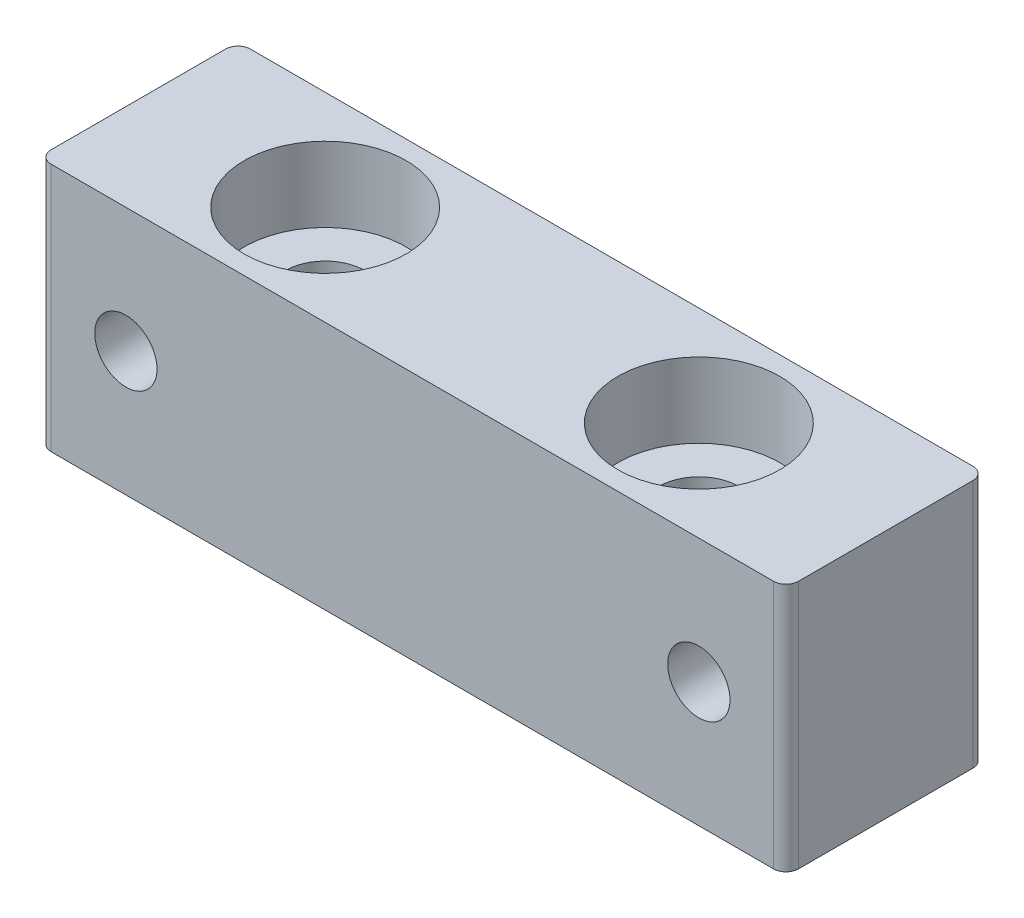
ISO-10303-21;
HEADER;
FILE_DESCRIPTION(('STEP AP214'),'2;1');
FILE_NAME('part.step','',(''),(''),'','','');
FILE_SCHEMA(('AUTOMOTIVE_DESIGN { 1 0 10303 214 1 1 1 1 }'));
ENDSEC;
DATA;
#1=APPLICATION_CONTEXT('core data for automotive mechanical design processes');
#2=APPLICATION_PROTOCOL_DEFINITION('international standard','automotive_design',2000,#1);
#3=PRODUCT_CONTEXT('',#1,'mechanical');
#4=PRODUCT('Part','Part','',(#3));
#5=PRODUCT_RELATED_PRODUCT_CATEGORY('part','',(#4));
#6=PRODUCT_DEFINITION_FORMATION('','',#4);
#7=PRODUCT_DEFINITION_CONTEXT('part definition',#1,'design');
#8=PRODUCT_DEFINITION('design','',#6,#7);
#9=PRODUCT_DEFINITION_SHAPE('','',#8);
#10=(LENGTH_UNIT() NAMED_UNIT(*) SI_UNIT(.MILLI.,.METRE.));
#11=(NAMED_UNIT(*) PLANE_ANGLE_UNIT() SI_UNIT($,.RADIAN.));
#12=(NAMED_UNIT(*) SI_UNIT($,.STERADIAN.) SOLID_ANGLE_UNIT());
#13=UNCERTAINTY_MEASURE_WITH_UNIT(LENGTH_MEASURE(1.E-05),#10,'distance_accuracy_value','');
#14=(GEOMETRIC_REPRESENTATION_CONTEXT(3) GLOBAL_UNCERTAINTY_ASSIGNED_CONTEXT((#13)) GLOBAL_UNIT_ASSIGNED_CONTEXT((#10,
#11,#12)) REPRESENTATION_CONTEXT('',''));
#15=CARTESIAN_POINT('',(0.,0.,0.));
#16=DIRECTION('',(0.,0.,1.));
#17=DIRECTION('',(1.,0.,0.));
#18=AXIS2_PLACEMENT_3D('',#15,#16,#17);
#19=CARTESIAN_POINT('',(-15.,10.,4.));
#20=DIRECTION('',(1.,0.,0.));
#21=DIRECTION('',(0.,0.,-1.));
#22=AXIS2_PLACEMENT_3D('',#19,#20,#21);
#23=PLANE('',#22);
#24=DIRECTION('',(0.,0.,1.));
#25=VECTOR('',#24,1.);
#26=CARTESIAN_POINT('',(-15.,0.,4.));
#27=LINE('',#26,#25);
#28=CARTESIAN_POINT('',(-15.,0.,-3.5));
#29=VERTEX_POINT('',#28);
#30=CARTESIAN_POINT('',(-15.,0.,3.5));
#31=VERTEX_POINT('',#30);
#32=EDGE_CURVE('E140',#29,#31,#27,.T.);
#33=ORIENTED_EDGE('',*,*,#32,.T.);
#34=DIRECTION('',(0.,-1.,0.));
#35=VECTOR('',#34,1.);
#36=CARTESIAN_POINT('',(-15.,10.,3.5));
#37=LINE('',#36,#35);
#38=CARTESIAN_POINT('',(-15.,10.,3.5));
#39=VERTEX_POINT('',#38);
#40=EDGE_CURVE('E11',#31,#39,#37,.F.);
#41=ORIENTED_EDGE('',*,*,#40,.T.);
#42=DIRECTION('',(0.,0.,1.));
#43=VECTOR('',#42,1.);
#44=CARTESIAN_POINT('',(-15.,10.,4.));
#45=LINE('',#44,#43);
#46=CARTESIAN_POINT('',(-15.,10.,-3.5));
#47=VERTEX_POINT('',#46);
#48=EDGE_CURVE('E138',#47,#39,#45,.T.);
#49=ORIENTED_EDGE('',*,*,#48,.F.);
#50=DIRECTION('',(0.,-1.,0.));
#51=VECTOR('',#50,1.);
#52=CARTESIAN_POINT('',(-15.,10.,-3.5));
#53=LINE('',#52,#51);
#54=EDGE_CURVE('E47',#47,#29,#53,.T.);
#55=ORIENTED_EDGE('',*,*,#54,.T.);
#56=EDGE_LOOP('',(#33,#41,#49,#55));
#57=FACE_BOUND('',#56,.T.);
#58=ADVANCED_FACE('F38',(#57),#23,.F.);
#59=CARTESIAN_POINT('',(15.,10.,4.));
#60=DIRECTION('',(0.,0.,-1.));
#61=DIRECTION('',(-1.,0.,0.));
#62=AXIS2_PLACEMENT_3D('',#59,#60,#61);
#63=PLANE('',#62);
#64=CARTESIAN_POINT('',(-11.5,5.,4.));
#65=DIRECTION('',(0.,0.,1.));
#66=DIRECTION('',(1.,0.,0.));
#67=AXIS2_PLACEMENT_3D('',#64,#65,#66);
#68=CIRCLE('',#67,1.25);
#69=CARTESIAN_POINT('',(-10.25,5.,4.));
#70=VERTEX_POINT('',#69);
#71=EDGE_CURVE('E242',#70,#70,#68,.T.);
#72=ORIENTED_EDGE('',*,*,#71,.F.);
#73=EDGE_LOOP('',(#72));
#74=FACE_BOUND('',#73,.T.);
#75=CARTESIAN_POINT('',(11.5,5.,4.));
#76=DIRECTION('',(0.,0.,1.));
#77=DIRECTION('',(1.,0.,0.));
#78=AXIS2_PLACEMENT_3D('',#75,#76,#77);
#79=CIRCLE('',#78,1.25);
#80=CARTESIAN_POINT('',(12.75,5.,4.));
#81=VERTEX_POINT('',#80);
#82=EDGE_CURVE('E234',#81,#81,#79,.T.);
#83=ORIENTED_EDGE('',*,*,#82,.F.);
#84=EDGE_LOOP('',(#83));
#85=FACE_BOUND('',#84,.T.);
#86=DIRECTION('',(1.,0.,0.));
#87=VECTOR('',#86,1.);
#88=CARTESIAN_POINT('',(15.,0.,4.));
#89=LINE('',#88,#87);
#90=CARTESIAN_POINT('',(-14.5,0.,4.));
#91=VERTEX_POINT('',#90);
#92=CARTESIAN_POINT('',(14.5,0.,4.));
#93=VERTEX_POINT('',#92);
#94=EDGE_CURVE('E134',#91,#93,#89,.T.);
#95=ORIENTED_EDGE('',*,*,#94,.T.);
#96=DIRECTION('',(0.,-1.,0.));
#97=VECTOR('',#96,1.);
#98=CARTESIAN_POINT('',(14.5,10.,4.));
#99=LINE('',#98,#97);
#100=CARTESIAN_POINT('',(14.5,10.,4.));
#101=VERTEX_POINT('',#100);
#102=EDGE_CURVE('E110',#93,#101,#99,.F.);
#103=ORIENTED_EDGE('',*,*,#102,.T.);
#104=DIRECTION('',(1.,0.,0.));
#105=VECTOR('',#104,1.);
#106=CARTESIAN_POINT('',(15.,10.,4.));
#107=LINE('',#106,#105);
#108=CARTESIAN_POINT('',(-14.5,10.,4.));
#109=VERTEX_POINT('',#108);
#110=EDGE_CURVE('E197',#109,#101,#107,.T.);
#111=ORIENTED_EDGE('',*,*,#110,.F.);
#112=DIRECTION('',(0.,-1.,0.));
#113=VECTOR('',#112,1.);
#114=CARTESIAN_POINT('',(-14.5,10.,4.));
#115=LINE('',#114,#113);
#116=EDGE_CURVE('E116',#109,#91,#115,.T.);
#117=ORIENTED_EDGE('',*,*,#116,.T.);
#118=EDGE_LOOP('',(#95,#103,#111,#117));
#119=FACE_BOUND('',#118,.T.);
#120=ADVANCED_FACE('F249',(#74,#85,#119),#63,.F.);
#121=CARTESIAN_POINT('',(15.,10.,4.));
#122=DIRECTION('',(-1.,0.,0.));
#123=DIRECTION('',(0.,0.,1.));
#124=AXIS2_PLACEMENT_3D('',#121,#122,#123);
#125=PLANE('',#124);
#126=DIRECTION('',(0.,0.,-1.));
#127=VECTOR('',#126,1.);
#128=CARTESIAN_POINT('',(15.,10.,4.));
#129=LINE('',#128,#127);
#130=CARTESIAN_POINT('',(15.,10.,3.5));
#131=VERTEX_POINT('',#130);
#132=CARTESIAN_POINT('',(15.,10.,-3.5));
#133=VERTEX_POINT('',#132);
#134=EDGE_CURVE('E125',#131,#133,#129,.T.);
#135=ORIENTED_EDGE('',*,*,#134,.F.);
#136=DIRECTION('',(0.,-1.,0.));
#137=VECTOR('',#136,1.);
#138=CARTESIAN_POINT('',(15.,10.,3.5));
#139=LINE('',#138,#137);
#140=CARTESIAN_POINT('',(15.,0.,3.5));
#141=VERTEX_POINT('',#140);
#142=EDGE_CURVE('E109',#131,#141,#139,.T.);
#143=ORIENTED_EDGE('',*,*,#142,.T.);
#144=DIRECTION('',(0.,0.,-1.));
#145=VECTOR('',#144,1.);
#146=CARTESIAN_POINT('',(15.,0.,4.));
#147=LINE('',#146,#145);
#148=CARTESIAN_POINT('',(15.,0.,-3.5));
#149=VERTEX_POINT('',#148);
#150=EDGE_CURVE('E123',#141,#149,#147,.T.);
#151=ORIENTED_EDGE('',*,*,#150,.T.);
#152=DIRECTION('',(0.,-1.,0.));
#153=VECTOR('',#152,1.);
#154=CARTESIAN_POINT('',(15.,10.,-3.5));
#155=LINE('',#154,#153);
#156=EDGE_CURVE('E128',#149,#133,#155,.F.);
#157=ORIENTED_EDGE('',*,*,#156,.T.);
#158=EDGE_LOOP('',(#135,#143,#151,#157));
#159=FACE_BOUND('',#158,.T.);
#160=ADVANCED_FACE('F122',(#159),#125,.F.);
#161=CARTESIAN_POINT('',(15.,10.,-4.));
#162=DIRECTION('',(0.,0.,1.));
#163=DIRECTION('',(1.,0.,0.));
#164=AXIS2_PLACEMENT_3D('',#161,#162,#163);
#165=PLANE('',#164);
#166=CARTESIAN_POINT('',(-11.5,5.,-4.));
#167=DIRECTION('',(0.,0.,1.));
#168=DIRECTION('',(1.,0.,0.));
#169=AXIS2_PLACEMENT_3D('',#166,#167,#168);
#170=CIRCLE('',#169,1.25);
#171=CARTESIAN_POINT('',(-10.25,5.,-4.));
#172=VERTEX_POINT('',#171);
#173=EDGE_CURVE('E238',#172,#172,#170,.T.);
#174=ORIENTED_EDGE('',*,*,#173,.T.);
#175=EDGE_LOOP('',(#174));
#176=FACE_BOUND('',#175,.T.);
#177=CARTESIAN_POINT('',(11.5,5.,-4.));
#178=DIRECTION('',(0.,0.,1.));
#179=DIRECTION('',(1.,0.,0.));
#180=AXIS2_PLACEMENT_3D('',#177,#178,#179);
#181=CIRCLE('',#180,1.25);
#182=CARTESIAN_POINT('',(12.75,5.,-4.));
#183=VERTEX_POINT('',#182);
#184=EDGE_CURVE('E230',#183,#183,#181,.T.);
#185=ORIENTED_EDGE('',*,*,#184,.T.);
#186=EDGE_LOOP('',(#185));
#187=FACE_BOUND('',#186,.T.);
#188=DIRECTION('',(-1.,0.,0.));
#189=VECTOR('',#188,1.);
#190=CARTESIAN_POINT('',(15.,10.,-4.));
#191=LINE('',#190,#189);
#192=CARTESIAN_POINT('',(14.5,10.,-4.));
#193=VERTEX_POINT('',#192);
#194=CARTESIAN_POINT('',(-14.5,10.,-4.));
#195=VERTEX_POINT('',#194);
#196=EDGE_CURVE('E145',#193,#195,#191,.T.);
#197=ORIENTED_EDGE('',*,*,#196,.F.);
#198=DIRECTION('',(0.,-1.,0.));
#199=VECTOR('',#198,1.);
#200=CARTESIAN_POINT('',(14.5,10.,-4.));
#201=LINE('',#200,#199);
#202=CARTESIAN_POINT('',(14.5,0.,-4.));
#203=VERTEX_POINT('',#202);
#204=EDGE_CURVE('E172',#193,#203,#201,.T.);
#205=ORIENTED_EDGE('',*,*,#204,.T.);
#206=DIRECTION('',(-1.,0.,0.));
#207=VECTOR('',#206,1.);
#208=CARTESIAN_POINT('',(15.,0.,-4.));
#209=LINE('',#208,#207);
#210=CARTESIAN_POINT('',(-14.5,0.,-4.));
#211=VERTEX_POINT('',#210);
#212=EDGE_CURVE('E133',#203,#211,#209,.T.);
#213=ORIENTED_EDGE('',*,*,#212,.T.);
#214=DIRECTION('',(0.,-1.,0.));
#215=VECTOR('',#214,1.);
#216=CARTESIAN_POINT('',(-14.5,10.,-4.));
#217=LINE('',#216,#215);
#218=EDGE_CURVE('E54',#211,#195,#217,.F.);
#219=ORIENTED_EDGE('',*,*,#218,.T.);
#220=EDGE_LOOP('',(#197,#205,#213,#219));
#221=FACE_BOUND('',#220,.T.);
#222=ADVANCED_FACE('F280',(#176,#187,#221),#165,.F.);
#223=CARTESIAN_POINT('',(0.,10.,0.));
#224=DIRECTION('',(0.,1.,0.));
#225=DIRECTION('',(0.,0.,1.));
#226=AXIS2_PLACEMENT_3D('',#223,#224,#225);
#227=PLANE('',#226);
#228=CARTESIAN_POINT('',(-7.5,10.,0.));
#229=DIRECTION('',(0.,1.,0.));
#230=DIRECTION('',(0.,0.,1.));
#231=AXIS2_PLACEMENT_3D('',#228,#229,#230);
#232=CIRCLE('',#231,3.25);
#233=CARTESIAN_POINT('',(-7.5,10.,3.25));
#234=VERTEX_POINT('',#233);
#235=EDGE_CURVE('E226',#234,#234,#232,.T.);
#236=ORIENTED_EDGE('',*,*,#235,.F.);
#237=EDGE_LOOP('',(#236));
#238=FACE_BOUND('',#237,.T.);
#239=CARTESIAN_POINT('',(7.5,10.,0.));
#240=DIRECTION('',(0.,1.,0.));
#241=DIRECTION('',(0.,0.,1.));
#242=AXIS2_PLACEMENT_3D('',#239,#240,#241);
#243=CIRCLE('',#242,3.25);
#244=CARTESIAN_POINT('',(7.5,10.,3.25));
#245=VERTEX_POINT('',#244);
#246=EDGE_CURVE('E210',#245,#245,#243,.T.);
#247=ORIENTED_EDGE('',*,*,#246,.F.);
#248=EDGE_LOOP('',(#247));
#249=FACE_BOUND('',#248,.T.);
#250=ORIENTED_EDGE('',*,*,#110,.T.);
#251=CARTESIAN_POINT('',(14.5,10.,3.5));
#252=DIRECTION('',(0.,1.,0.));
#253=DIRECTION('',(0.,0.,1.));
#254=AXIS2_PLACEMENT_3D('',#251,#252,#253);
#255=CIRCLE('',#254,0.5);
#256=EDGE_CURVE('E167',#101,#131,#255,.T.);
#257=ORIENTED_EDGE('',*,*,#256,.T.);
#258=ORIENTED_EDGE('',*,*,#134,.T.);
#259=CARTESIAN_POINT('',(14.5,10.,-3.5));
#260=DIRECTION('',(0.,1.,0.));
#261=DIRECTION('',(0.,0.,1.));
#262=AXIS2_PLACEMENT_3D('',#259,#260,#261);
#263=CIRCLE('',#262,0.5);
#264=EDGE_CURVE('E61',#133,#193,#263,.T.);
#265=ORIENTED_EDGE('',*,*,#264,.T.);
#266=ORIENTED_EDGE('',*,*,#196,.T.);
#267=CARTESIAN_POINT('',(-14.5,10.,-3.5));
#268=DIRECTION('',(0.,1.,0.));
#269=DIRECTION('',(0.,0.,1.));
#270=AXIS2_PLACEMENT_3D('',#267,#268,#269);
#271=CIRCLE('',#270,0.5);
#272=EDGE_CURVE('E159',#195,#47,#271,.T.);
#273=ORIENTED_EDGE('',*,*,#272,.T.);
#274=ORIENTED_EDGE('',*,*,#48,.T.);
#275=CARTESIAN_POINT('',(-14.5,10.,3.5));
#276=DIRECTION('',(0.,1.,0.));
#277=DIRECTION('',(0.,0.,1.));
#278=AXIS2_PLACEMENT_3D('',#275,#276,#277);
#279=CIRCLE('',#278,0.5);
#280=EDGE_CURVE('E162',#39,#109,#279,.T.);
#281=ORIENTED_EDGE('',*,*,#280,.T.);
#282=EDGE_LOOP('',(#250,#257,#258,#265,#266,#273,#274,#281));
#283=FACE_BOUND('',#282,.T.);
#284=ADVANCED_FACE('F260',(#238,#249,#283),#227,.T.);
#285=CARTESIAN_POINT('',(0.,0.,0.));
#286=DIRECTION('',(0.,1.,0.));
#287=DIRECTION('',(0.,0.,1.));
#288=AXIS2_PLACEMENT_3D('',#285,#286,#287);
#289=PLANE('',#288);
#290=CARTESIAN_POINT('',(-7.5,0.,0.));
#291=DIRECTION('',(0.,1.,0.));
#292=DIRECTION('',(0.,0.,1.));
#293=AXIS2_PLACEMENT_3D('',#290,#291,#292);
#294=CIRCLE('',#293,1.6);
#295=CARTESIAN_POINT('',(-7.5,0.,1.6));
#296=VERTEX_POINT('',#295);
#297=EDGE_CURVE('E214',#296,#296,#294,.T.);
#298=ORIENTED_EDGE('',*,*,#297,.T.);
#299=EDGE_LOOP('',(#298));
#300=FACE_BOUND('',#299,.T.);
#301=CARTESIAN_POINT('',(7.5,0.,0.));
#302=DIRECTION('',(0.,1.,0.));
#303=DIRECTION('',(0.,0.,1.));
#304=AXIS2_PLACEMENT_3D('',#301,#302,#303);
#305=CIRCLE('',#304,1.6);
#306=CARTESIAN_POINT('',(7.5,0.,1.6));
#307=VERTEX_POINT('',#306);
#308=EDGE_CURVE('E187',#307,#307,#305,.T.);
#309=ORIENTED_EDGE('',*,*,#308,.T.);
#310=EDGE_LOOP('',(#309));
#311=FACE_BOUND('',#310,.T.);
#312=ORIENTED_EDGE('',*,*,#150,.F.);
#313=CARTESIAN_POINT('',(14.5,0.,3.5));
#314=DIRECTION('',(0.,1.,0.));
#315=DIRECTION('',(0.,0.,1.));
#316=AXIS2_PLACEMENT_3D('',#313,#314,#315);
#317=CIRCLE('',#316,0.5);
#318=EDGE_CURVE('E105',#141,#93,#317,.F.);
#319=ORIENTED_EDGE('',*,*,#318,.T.);
#320=ORIENTED_EDGE('',*,*,#94,.F.);
#321=CARTESIAN_POINT('',(-14.5,0.,3.5));
#322=DIRECTION('',(0.,1.,0.));
#323=DIRECTION('',(0.,0.,1.));
#324=AXIS2_PLACEMENT_3D('',#321,#322,#323);
#325=CIRCLE('',#324,0.5);
#326=EDGE_CURVE('E149',#91,#31,#325,.F.);
#327=ORIENTED_EDGE('',*,*,#326,.T.);
#328=ORIENTED_EDGE('',*,*,#32,.F.);
#329=CARTESIAN_POINT('',(-14.5,0.,-3.5));
#330=DIRECTION('',(0.,1.,0.));
#331=DIRECTION('',(0.,0.,1.));
#332=AXIS2_PLACEMENT_3D('',#329,#330,#331);
#333=CIRCLE('',#332,0.5);
#334=EDGE_CURVE('E127',#29,#211,#333,.F.);
#335=ORIENTED_EDGE('',*,*,#334,.T.);
#336=ORIENTED_EDGE('',*,*,#212,.F.);
#337=CARTESIAN_POINT('',(14.5,0.,-3.5));
#338=DIRECTION('',(0.,1.,0.));
#339=DIRECTION('',(0.,0.,1.));
#340=AXIS2_PLACEMENT_3D('',#337,#338,#339);
#341=CIRCLE('',#340,0.5);
#342=EDGE_CURVE('E117',#203,#149,#341,.F.);
#343=ORIENTED_EDGE('',*,*,#342,.T.);
#344=EDGE_LOOP('',(#312,#319,#320,#327,#328,#335,#336,#343));
#345=FACE_BOUND('',#344,.T.);
#346=ADVANCED_FACE('F130',(#300,#311,#345),#289,.F.);
#347=CARTESIAN_POINT('',(7.5,10.,0.));
#348=DIRECTION('',(0.,1.,0.));
#349=DIRECTION('',(0.,0.,1.));
#350=AXIS2_PLACEMENT_3D('',#347,#348,#349);
#351=CYLINDRICAL_SURFACE('',#350,1.6);
#352=ORIENTED_EDGE('',*,*,#308,.F.);
#353=EDGE_LOOP('',(#352));
#354=FACE_BOUND('',#353,.T.);
#355=CARTESIAN_POINT('',(7.5,7.,0.));
#356=DIRECTION('',(0.,1.,0.));
#357=DIRECTION('',(0.,0.,1.));
#358=AXIS2_PLACEMENT_3D('',#355,#356,#357);
#359=CIRCLE('',#358,1.6);
#360=CARTESIAN_POINT('',(7.5,7.,1.6));
#361=VERTEX_POINT('',#360);
#362=EDGE_CURVE('E190',#361,#361,#359,.T.);
#363=ORIENTED_EDGE('',*,*,#362,.T.);
#364=EDGE_LOOP('',(#363));
#365=FACE_BOUND('',#364,.T.);
#366=ADVANCED_FACE('F293',(#354,#365),#351,.F.);
#367=CARTESIAN_POINT('',(9.1,7.,0.));
#368=DIRECTION('',(0.,-1.,0.));
#369=DIRECTION('',(0.,0.,-1.));
#370=AXIS2_PLACEMENT_3D('',#367,#368,#369);
#371=PLANE('',#370);
#372=ORIENTED_EDGE('',*,*,#362,.F.);
#373=EDGE_LOOP('',(#372));
#374=FACE_BOUND('',#373,.T.);
#375=CARTESIAN_POINT('',(7.5,7.,0.));
#376=DIRECTION('',(0.,1.,0.));
#377=DIRECTION('',(0.,0.,1.));
#378=AXIS2_PLACEMENT_3D('',#375,#376,#377);
#379=CIRCLE('',#378,3.25);
#380=CARTESIAN_POINT('',(7.5,7.,3.25));
#381=VERTEX_POINT('',#380);
#382=EDGE_CURVE('E206',#381,#381,#379,.T.);
#383=ORIENTED_EDGE('',*,*,#382,.T.);
#384=EDGE_LOOP('',(#383));
#385=FACE_BOUND('',#384,.T.);
#386=ADVANCED_FACE('F298',(#374,#385),#371,.F.);
#387=CARTESIAN_POINT('',(7.5,10.,0.));
#388=DIRECTION('',(0.,1.,0.));
#389=DIRECTION('',(0.,0.,1.));
#390=AXIS2_PLACEMENT_3D('',#387,#388,#389);
#391=CYLINDRICAL_SURFACE('',#390,3.25);
#392=ORIENTED_EDGE('',*,*,#382,.F.);
#393=EDGE_LOOP('',(#392));
#394=FACE_BOUND('',#393,.T.);
#395=ORIENTED_EDGE('',*,*,#246,.T.);
#396=EDGE_LOOP('',(#395));
#397=FACE_BOUND('',#396,.T.);
#398=ADVANCED_FACE('F302',(#394,#397),#391,.F.);
#399=CARTESIAN_POINT('',(-7.5,10.,0.));
#400=DIRECTION('',(0.,1.,0.));
#401=DIRECTION('',(0.,0.,1.));
#402=AXIS2_PLACEMENT_3D('',#399,#400,#401);
#403=CYLINDRICAL_SURFACE('',#402,1.6);
#404=ORIENTED_EDGE('',*,*,#297,.F.);
#405=EDGE_LOOP('',(#404));
#406=FACE_BOUND('',#405,.T.);
#407=CARTESIAN_POINT('',(-7.5,7.,0.));
#408=DIRECTION('',(0.,1.,0.));
#409=DIRECTION('',(0.,0.,1.));
#410=AXIS2_PLACEMENT_3D('',#407,#408,#409);
#411=CIRCLE('',#410,1.6);
#412=CARTESIAN_POINT('',(-7.5,7.,1.6));
#413=VERTEX_POINT('',#412);
#414=EDGE_CURVE('E218',#413,#413,#411,.T.);
#415=ORIENTED_EDGE('',*,*,#414,.T.);
#416=EDGE_LOOP('',(#415));
#417=FACE_BOUND('',#416,.T.);
#418=ADVANCED_FACE('F306',(#406,#417),#403,.F.);
#419=CARTESIAN_POINT('',(-5.9,7.,0.));
#420=DIRECTION('',(0.,-1.,0.));
#421=DIRECTION('',(0.,0.,-1.));
#422=AXIS2_PLACEMENT_3D('',#419,#420,#421);
#423=PLANE('',#422);
#424=ORIENTED_EDGE('',*,*,#414,.F.);
#425=EDGE_LOOP('',(#424));
#426=FACE_BOUND('',#425,.T.);
#427=CARTESIAN_POINT('',(-7.5,7.,0.));
#428=DIRECTION('',(0.,1.,0.));
#429=DIRECTION('',(0.,0.,1.));
#430=AXIS2_PLACEMENT_3D('',#427,#428,#429);
#431=CIRCLE('',#430,3.25);
#432=CARTESIAN_POINT('',(-7.5,7.,3.25));
#433=VERTEX_POINT('',#432);
#434=EDGE_CURVE('E222',#433,#433,#431,.T.);
#435=ORIENTED_EDGE('',*,*,#434,.T.);
#436=EDGE_LOOP('',(#435));
#437=FACE_BOUND('',#436,.T.);
#438=ADVANCED_FACE('F310',(#426,#437),#423,.F.);
#439=CARTESIAN_POINT('',(-7.5,10.,0.));
#440=DIRECTION('',(0.,1.,0.));
#441=DIRECTION('',(0.,0.,1.));
#442=AXIS2_PLACEMENT_3D('',#439,#440,#441);
#443=CYLINDRICAL_SURFACE('',#442,3.25);
#444=ORIENTED_EDGE('',*,*,#434,.F.);
#445=EDGE_LOOP('',(#444));
#446=FACE_BOUND('',#445,.T.);
#447=ORIENTED_EDGE('',*,*,#235,.T.);
#448=EDGE_LOOP('',(#447));
#449=FACE_BOUND('',#448,.T.);
#450=ADVANCED_FACE('F314',(#446,#449),#443,.F.);
#451=CARTESIAN_POINT('',(11.5,5.,4.));
#452=DIRECTION('',(0.,0.,1.));
#453=DIRECTION('',(1.,0.,0.));
#454=AXIS2_PLACEMENT_3D('',#451,#452,#453);
#455=CYLINDRICAL_SURFACE('',#454,1.25);
#456=ORIENTED_EDGE('',*,*,#184,.F.);
#457=EDGE_LOOP('',(#456));
#458=FACE_BOUND('',#457,.T.);
#459=ORIENTED_EDGE('',*,*,#82,.T.);
#460=EDGE_LOOP('',(#459));
#461=FACE_BOUND('',#460,.T.);
#462=ADVANCED_FACE('F318',(#458,#461),#455,.F.);
#463=CARTESIAN_POINT('',(-11.5,5.,4.));
#464=DIRECTION('',(0.,0.,1.));
#465=DIRECTION('',(1.,0.,0.));
#466=AXIS2_PLACEMENT_3D('',#463,#464,#465);
#467=CYLINDRICAL_SURFACE('',#466,1.25);
#468=ORIENTED_EDGE('',*,*,#173,.F.);
#469=EDGE_LOOP('',(#468));
#470=FACE_BOUND('',#469,.T.);
#471=ORIENTED_EDGE('',*,*,#71,.T.);
#472=EDGE_LOOP('',(#471));
#473=FACE_BOUND('',#472,.T.);
#474=ADVANCED_FACE('F247',(#470,#473),#467,.F.);
#475=CARTESIAN_POINT('',(14.5,10.,3.5));
#476=DIRECTION('',(0.,-1.,0.));
#477=DIRECTION('',(0.,0.,-1.));
#478=AXIS2_PLACEMENT_3D('',#475,#476,#477);
#479=CYLINDRICAL_SURFACE('',#478,0.5);
#480=ORIENTED_EDGE('',*,*,#256,.F.);
#481=ORIENTED_EDGE('',*,*,#102,.F.);
#482=ORIENTED_EDGE('',*,*,#318,.F.);
#483=ORIENTED_EDGE('',*,*,#142,.F.);
#484=EDGE_LOOP('',(#480,#481,#482,#483));
#485=FACE_BOUND('',#484,.T.);
#486=ADVANCED_FACE('F108',(#485),#479,.T.);
#487=CARTESIAN_POINT('',(14.5,10.,-3.5));
#488=DIRECTION('',(0.,-1.,0.));
#489=DIRECTION('',(0.,0.,-1.));
#490=AXIS2_PLACEMENT_3D('',#487,#488,#489);
#491=CYLINDRICAL_SURFACE('',#490,0.5);
#492=ORIENTED_EDGE('',*,*,#264,.F.);
#493=ORIENTED_EDGE('',*,*,#156,.F.);
#494=ORIENTED_EDGE('',*,*,#342,.F.);
#495=ORIENTED_EDGE('',*,*,#204,.F.);
#496=EDGE_LOOP('',(#492,#493,#494,#495));
#497=FACE_BOUND('',#496,.T.);
#498=ADVANCED_FACE('F265',(#497),#491,.T.);
#499=CARTESIAN_POINT('',(-14.5,10.,3.5));
#500=DIRECTION('',(0.,-1.,0.));
#501=DIRECTION('',(0.,0.,-1.));
#502=AXIS2_PLACEMENT_3D('',#499,#500,#501);
#503=CYLINDRICAL_SURFACE('',#502,0.5);
#504=ORIENTED_EDGE('',*,*,#280,.F.);
#505=ORIENTED_EDGE('',*,*,#40,.F.);
#506=ORIENTED_EDGE('',*,*,#326,.F.);
#507=ORIENTED_EDGE('',*,*,#116,.F.);
#508=EDGE_LOOP('',(#504,#505,#506,#507));
#509=FACE_BOUND('',#508,.T.);
#510=ADVANCED_FACE('F259',(#509),#503,.T.);
#511=CARTESIAN_POINT('',(-14.5,10.,-3.5));
#512=DIRECTION('',(0.,-1.,0.));
#513=DIRECTION('',(0.,0.,-1.));
#514=AXIS2_PLACEMENT_3D('',#511,#512,#513);
#515=CYLINDRICAL_SURFACE('',#514,0.5);
#516=ORIENTED_EDGE('',*,*,#272,.F.);
#517=ORIENTED_EDGE('',*,*,#218,.F.);
#518=ORIENTED_EDGE('',*,*,#334,.F.);
#519=ORIENTED_EDGE('',*,*,#54,.F.);
#520=EDGE_LOOP('',(#516,#517,#518,#519));
#521=FACE_BOUND('',#520,.T.);
#522=ADVANCED_FACE('F40',(#521),#515,.T.);
#523=CLOSED_SHELL('',(#58,#120,#160,#222,#284,#346,#366,#386,#398,#418,#438,#450,#462,#474,#486,
#498,#510,#522));
#524=MANIFOLD_SOLID_BREP('B2',#523);
#525=ADVANCED_BREP_SHAPE_REPRESENTATION('',(#18,#524),#14);
#526=SHAPE_DEFINITION_REPRESENTATION(#9,#525);
ENDSEC;
END-ISO-10303-21;
